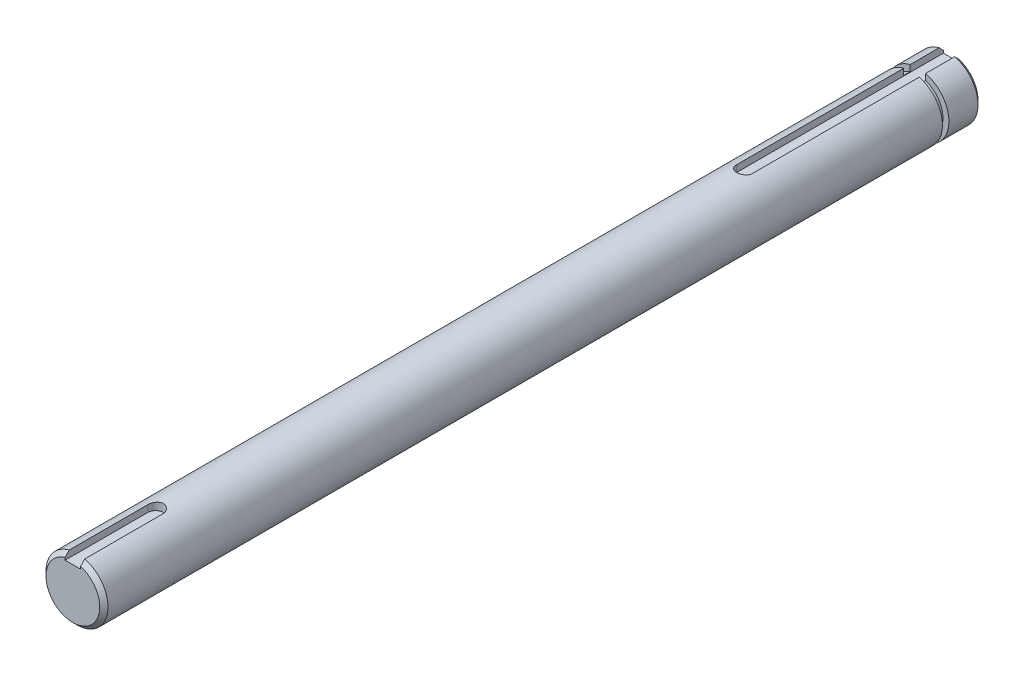
ISO-10303-21;
HEADER;
FILE_DESCRIPTION(('STEP AP214'),'2;1');
FILE_NAME('part.step','',(''),(''),'','','');
FILE_SCHEMA(('AUTOMOTIVE_DESIGN { 1 0 10303 214 1 1 1 1 }'));
ENDSEC;
DATA;
#1=APPLICATION_CONTEXT('core data for automotive mechanical design processes');
#2=APPLICATION_PROTOCOL_DEFINITION('international standard','automotive_design',2000,#1);
#3=PRODUCT_CONTEXT('',#1,'mechanical');
#4=PRODUCT('Part','Part','',(#3));
#5=PRODUCT_RELATED_PRODUCT_CATEGORY('part','',(#4));
#6=PRODUCT_DEFINITION_FORMATION('','',#4);
#7=PRODUCT_DEFINITION_CONTEXT('part definition',#1,'design');
#8=PRODUCT_DEFINITION('design','',#6,#7);
#9=PRODUCT_DEFINITION_SHAPE('','',#8);
#10=(LENGTH_UNIT() NAMED_UNIT(*) SI_UNIT(.MILLI.,.METRE.));
#11=(NAMED_UNIT(*) PLANE_ANGLE_UNIT() SI_UNIT($,.RADIAN.));
#12=(NAMED_UNIT(*) SI_UNIT($,.STERADIAN.) SOLID_ANGLE_UNIT());
#13=UNCERTAINTY_MEASURE_WITH_UNIT(LENGTH_MEASURE(1.E-05),#10,'distance_accuracy_value','');
#14=(GEOMETRIC_REPRESENTATION_CONTEXT(3) GLOBAL_UNCERTAINTY_ASSIGNED_CONTEXT((#13)) GLOBAL_UNIT_ASSIGNED_CONTEXT((#10,
#11,#12)) REPRESENTATION_CONTEXT('',''));
#15=CARTESIAN_POINT('',(0.,0.,0.));
#16=DIRECTION('',(0.,0.,1.));
#17=DIRECTION('',(1.,0.,0.));
#18=AXIS2_PLACEMENT_3D('',#15,#16,#17);
#19=CARTESIAN_POINT('',(0.,0.,0.634999999874708));
#20=DIRECTION('',(0.,0.,1.));
#21=DIRECTION('',(1.,0.,0.));
#22=AXIS2_PLACEMENT_3D('',#19,#20,#21);
#23=CONICAL_SURFACE('',#22,4.76249999991296,0.785398163397448);
#24=CARTESIAN_POINT('',(0.,0.,0.634999999999997));
#25=DIRECTION('',(0.,0.,-1.));
#26=DIRECTION('',(-1.,0.,0.));
#27=AXIS2_PLACEMENT_3D('',#24,#25,#26);
#28=CIRCLE('',#27,4.7625);
#29=CARTESIAN_POINT('',(-1.190625,4.61127079658254,0.63499999998507));
#30=VERTEX_POINT('',#29);
#31=CARTESIAN_POINT('',(1.190625,4.61127079658254,0.634999999985069));
#32=VERTEX_POINT('',#31);
#33=EDGE_CURVE('E138',#30,#32,#28,.F.);
#34=ORIENTED_EDGE('',*,*,#33,.F.);
#35=CARTESIAN_POINT('',(-1.190625,4.61127079658688,0.634999999970144));
#36=CARTESIAN_POINT('',(-1.190625,4.50169371341556,0.528861792536142));
#37=CARTESIAN_POINT('',(-1.190625,4.39196978784519,0.422876029411193));
#38=CARTESIAN_POINT('',(-1.190625,4.17222822168394,0.211209362667619));
#39=CARTESIAN_POINT('',(-1.190625,4.06221058101229,0.105528459132862));
#40=CARTESIAN_POINT('',(-1.190625,3.95204609786079,-8.97789113808919E-12));
#41=B_SPLINE_CURVE_WITH_KNOTS('',3,(#35,#36,#37,#38,#39,#40),.UNSPECIFIED.,.F.,.F.,(4,2,4),(0.,
0.457658056249166,0.915316238387231),.UNSPECIFIED.);
#42=CARTESIAN_POINT('',(-1.190625,3.95204609786548,-4.48885970284581E-12));
#43=VERTEX_POINT('',#42);
#44=EDGE_CURVE('E126',#30,#43,#41,.T.);
#45=ORIENTED_EDGE('',*,*,#44,.T.);
#46=CARTESIAN_POINT('',(0.,0.,0.));
#47=DIRECTION('',(0.,0.,1.));
#48=DIRECTION('',(1.,0.,0.));
#49=AXIS2_PLACEMENT_3D('',#46,#47,#48);
#50=CIRCLE('',#49,4.12750000003825);
#51=CARTESIAN_POINT('',(1.190625,3.95204609786548,-4.48893847578627E-12));
#52=VERTEX_POINT('',#51);
#53=EDGE_CURVE('E128',#43,#52,#50,.T.);
#54=ORIENTED_EDGE('',*,*,#53,.T.);
#55=CARTESIAN_POINT('',(1.190625,3.95204609786079,-8.97770320053053E-12));
#56=CARTESIAN_POINT('',(1.190625,4.06221058101229,0.105528459132862));
#57=CARTESIAN_POINT('',(1.190625,4.17222822168394,0.211209362667619));
#58=CARTESIAN_POINT('',(1.190625,4.39196978784518,0.422876029411192));
#59=CARTESIAN_POINT('',(1.190625,4.50169371341556,0.528861792536141));
#60=CARTESIAN_POINT('',(1.190625,4.61127079658688,0.634999999970141));
#61=B_SPLINE_CURVE_WITH_KNOTS('',3,(#55,#56,#57,#58,#59,#60),.UNSPECIFIED.,.F.,.F.,(4,2,4),(0.,
0.457658182138063,0.915316238387226),.UNSPECIFIED.);
#62=EDGE_CURVE('E21',#52,#32,#61,.T.);
#63=ORIENTED_EDGE('',*,*,#62,.T.);
#64=EDGE_LOOP('',(#34,#45,#54,#63));
#65=FACE_BOUND('',#64,.T.);
#66=ADVANCED_FACE('F17',(#65),#23,.T.);
#67=CARTESIAN_POINT('',(0.,0.,0.));
#68=DIRECTION('',(0.,0.,1.));
#69=DIRECTION('',(1.,0.,0.));
#70=AXIS2_PLACEMENT_3D('',#67,#68,#69);
#71=PLANE('',#70);
#72=ORIENTED_EDGE('',*,*,#53,.F.);
#73=DIRECTION('',(0.,1.,0.));
#74=VECTOR('',#73,1.);
#75=CARTESIAN_POINT('',(-1.190625,0.,0.));
#76=LINE('',#75,#74);
#77=CARTESIAN_POINT('',(-1.190625,3.571875,0.));
#78=VERTEX_POINT('',#77);
#79=EDGE_CURVE('E132',#78,#43,#76,.T.);
#80=ORIENTED_EDGE('',*,*,#79,.F.);
#81=DIRECTION('',(1.,0.,0.));
#82=VECTOR('',#81,1.);
#83=CARTESIAN_POINT('',(0.,3.571875,0.));
#84=LINE('',#83,#82);
#85=CARTESIAN_POINT('',(1.190625,3.571875,0.));
#86=VERTEX_POINT('',#85);
#87=EDGE_CURVE('E136',#86,#78,#84,.F.);
#88=ORIENTED_EDGE('',*,*,#87,.F.);
#89=DIRECTION('',(0.,1.,0.));
#90=VECTOR('',#89,1.);
#91=CARTESIAN_POINT('',(1.190625,0.,0.));
#92=LINE('',#91,#90);
#93=EDGE_CURVE('E119',#52,#86,#92,.F.);
#94=ORIENTED_EDGE('',*,*,#93,.F.);
#95=EDGE_LOOP('',(#72,#80,#88,#94));
#96=FACE_BOUND('',#95,.T.);
#97=ADVANCED_FACE('F134',(#96),#71,.F.);
#98=CARTESIAN_POINT('',(0.,0.,134.8994));
#99=DIRECTION('',(0.,0.,-1.));
#100=DIRECTION('',(-1.,0.,0.));
#101=AXIS2_PLACEMENT_3D('',#98,#99,#100);
#102=CYLINDRICAL_SURFACE('',#101,4.7625);
#103=DIRECTION('',(0.,0.,-1.));
#104=VECTOR('',#103,1.);
#105=CARTESIAN_POINT('',(-1.190625,4.61127079657821,0.));
#106=LINE('',#105,#104);
#107=CARTESIAN_POINT('',(-1.190625,4.61127079657821,5.10540000000001));
#108=VERTEX_POINT('',#107);
#109=EDGE_CURVE('E267',#30,#108,#106,.F.);
#110=ORIENTED_EDGE('',*,*,#109,.F.);
#111=ORIENTED_EDGE('',*,*,#33,.T.);
#112=DIRECTION('',(0.,0.,1.));
#113=VECTOR('',#112,1.);
#114=CARTESIAN_POINT('',(1.190625,4.61127079657821,0.));
#115=LINE('',#114,#113);
#116=CARTESIAN_POINT('',(1.190625,4.61127079657821,5.1054));
#117=VERTEX_POINT('',#116);
#118=EDGE_CURVE('E123',#117,#32,#115,.F.);
#119=ORIENTED_EDGE('',*,*,#118,.F.);
#120=CARTESIAN_POINT('',(0.,0.,5.10540000000001));
#121=DIRECTION('',(0.,0.,-1.));
#122=DIRECTION('',(-1.,0.,0.));
#123=AXIS2_PLACEMENT_3D('',#120,#121,#122);
#124=CIRCLE('',#123,4.7625);
#125=EDGE_CURVE('E276',#108,#117,#124,.F.);
#126=ORIENTED_EDGE('',*,*,#125,.F.);
#127=EDGE_LOOP('',(#110,#111,#119,#126));
#128=FACE_BOUND('',#127,.T.);
#129=ADVANCED_FACE('F321',(#128),#102,.T.);
#130=CARTESIAN_POINT('',(0.,3.571875,0.));
#131=DIRECTION('',(0.,1.,0.));
#132=DIRECTION('',(0.,0.,1.));
#133=AXIS2_PLACEMENT_3D('',#130,#131,#132);
#134=PLANE('',#133);
#135=DIRECTION('',(0.,0.,1.));
#136=VECTOR('',#135,1.);
#137=CARTESIAN_POINT('',(1.190625,3.571875,0.));
#138=LINE('',#137,#136);
#139=CARTESIAN_POINT('',(1.190625,3.571875,31.75));
#140=VERTEX_POINT('',#139);
#141=EDGE_CURVE('E264',#86,#140,#138,.T.);
#142=ORIENTED_EDGE('',*,*,#141,.F.);
#143=ORIENTED_EDGE('',*,*,#87,.T.);
#144=DIRECTION('',(0.,0.,-1.));
#145=VECTOR('',#144,1.);
#146=CARTESIAN_POINT('',(-1.190625,3.571875,0.));
#147=LINE('',#146,#145);
#148=CARTESIAN_POINT('',(-1.190625,3.571875,31.75));
#149=VERTEX_POINT('',#148);
#150=EDGE_CURVE('E252',#149,#78,#147,.T.);
#151=ORIENTED_EDGE('',*,*,#150,.F.);
#152=CARTESIAN_POINT('',(0.,3.571875,31.75));
#153=DIRECTION('',(0.,1.,0.));
#154=DIRECTION('',(0.,0.,1.));
#155=AXIS2_PLACEMENT_3D('',#152,#153,#154);
#156=CIRCLE('',#155,1.190625);
#157=EDGE_CURVE('E260',#149,#140,#156,.T.);
#158=ORIENTED_EDGE('',*,*,#157,.T.);
#159=EDGE_LOOP('',(#142,#143,#151,#158));
#160=FACE_BOUND('',#159,.T.);
#161=ADVANCED_FACE('F328',(#160),#134,.T.);
#162=CARTESIAN_POINT('',(0.,3.571875,0.));
#163=DIRECTION('',(0.,1.,0.));
#164=DIRECTION('',(0.,0.,1.));
#165=AXIS2_PLACEMENT_3D('',#162,#163,#164);
#166=PLANE('',#165);
#167=DIRECTION('',(0.,0.,1.));
#168=VECTOR('',#167,1.);
#169=CARTESIAN_POINT('',(-1.19062500000001,3.571875,0.));
#170=LINE('',#169,#168);
#171=CARTESIAN_POINT('',(-1.190625,3.571875,122.1994));
#172=VERTEX_POINT('',#171);
#173=CARTESIAN_POINT('',(-1.190625,3.571875,134.8994));
#174=VERTEX_POINT('',#173);
#175=EDGE_CURVE('E282',#172,#174,#170,.T.);
#176=ORIENTED_EDGE('',*,*,#175,.T.);
#177=DIRECTION('',(1.,0.,0.));
#178=VECTOR('',#177,1.);
#179=CARTESIAN_POINT('',(0.,3.571875,134.8994));
#180=LINE('',#179,#178);
#181=CARTESIAN_POINT('',(1.190625,3.571875,134.8994));
#182=VERTEX_POINT('',#181);
#183=EDGE_CURVE('E270',#182,#174,#180,.F.);
#184=ORIENTED_EDGE('',*,*,#183,.F.);
#185=DIRECTION('',(0.,0.,-1.));
#186=VECTOR('',#185,1.);
#187=CARTESIAN_POINT('',(1.19062499999998,3.571875,0.));
#188=LINE('',#187,#186);
#189=CARTESIAN_POINT('',(1.190625,3.571875,122.1994));
#190=VERTEX_POINT('',#189);
#191=EDGE_CURVE('E246',#182,#190,#188,.T.);
#192=ORIENTED_EDGE('',*,*,#191,.T.);
#193=CARTESIAN_POINT('',(0.,3.571875,122.1994));
#194=DIRECTION('',(0.,1.,0.));
#195=DIRECTION('',(0.,0.,1.));
#196=AXIS2_PLACEMENT_3D('',#193,#194,#195);
#197=CIRCLE('',#196,1.190625);
#198=EDGE_CURVE('E205',#190,#172,#197,.T.);
#199=ORIENTED_EDGE('',*,*,#198,.T.);
#200=EDGE_LOOP('',(#176,#184,#192,#199));
#201=FACE_BOUND('',#200,.T.);
#202=ADVANCED_FACE('F348',(#201),#166,.T.);
#203=CARTESIAN_POINT('',(4.7625,0.,5.1054));
#204=DIRECTION('',(0.,0.,1.));
#205=DIRECTION('',(1.,0.,0.));
#206=AXIS2_PLACEMENT_3D('',#203,#204,#205);
#207=PLANE('',#206);
#208=DIRECTION('',(0.,1.,0.));
#209=VECTOR('',#208,1.);
#210=CARTESIAN_POINT('',(-1.190625,3.571875,5.10540000000001));
#211=LINE('',#210,#209);
#212=CARTESIAN_POINT('',(-1.190625,3.65927393336096,5.1054));
#213=VERTEX_POINT('',#212);
#214=EDGE_CURVE('E256',#108,#213,#211,.F.);
#215=ORIENTED_EDGE('',*,*,#214,.F.);
#216=ORIENTED_EDGE('',*,*,#125,.T.);
#217=DIRECTION('',(0.,1.,0.));
#218=VECTOR('',#217,1.);
#219=CARTESIAN_POINT('',(1.190625,3.571875,5.1054));
#220=LINE('',#219,#218);
#221=CARTESIAN_POINT('',(1.190625,3.65927393336096,5.1054));
#222=VERTEX_POINT('',#221);
#223=EDGE_CURVE('E268',#222,#117,#220,.T.);
#224=ORIENTED_EDGE('',*,*,#223,.F.);
#225=CARTESIAN_POINT('',(0.,0.,5.1054));
#226=DIRECTION('',(0.,0.,-1.));
#227=DIRECTION('',(-1.,0.,0.));
#228=AXIS2_PLACEMENT_3D('',#225,#226,#227);
#229=CIRCLE('',#228,3.8481);
#230=EDGE_CURVE('E204',#213,#222,#229,.F.);
#231=ORIENTED_EDGE('',*,*,#230,.F.);
#232=EDGE_LOOP('',(#215,#216,#224,#231));
#233=FACE_BOUND('',#232,.T.);
#234=ADVANCED_FACE('F317',(#233),#207,.T.);
#235=CARTESIAN_POINT('',(0.,0.,134.8994));
#236=DIRECTION('',(0.,0.,1.));
#237=DIRECTION('',(1.,0.,0.));
#238=AXIS2_PLACEMENT_3D('',#235,#236,#237);
#239=PLANE('',#238);
#240=DIRECTION('',(0.,1.,0.));
#241=VECTOR('',#240,1.);
#242=CARTESIAN_POINT('',(1.190625,3.571875,134.8994));
#243=LINE('',#242,#241);
#244=CARTESIAN_POINT('',(1.190625,3.95204609781389,134.899399999992));
#245=VERTEX_POINT('',#244);
#246=EDGE_CURVE('E202',#245,#182,#243,.F.);
#247=ORIENTED_EDGE('',*,*,#246,.T.);
#248=ORIENTED_EDGE('',*,*,#183,.T.);
#249=DIRECTION('',(0.,1.,0.));
#250=VECTOR('',#249,1.);
#251=CARTESIAN_POINT('',(-1.190625,3.571875,134.8994));
#252=LINE('',#251,#250);
#253=CARTESIAN_POINT('',(-1.190625,3.95204609780807,134.899399999997));
#254=VERTEX_POINT('',#253);
#255=EDGE_CURVE('E285',#174,#254,#252,.T.);
#256=ORIENTED_EDGE('',*,*,#255,.T.);
#257=CARTESIAN_POINT('',(0.,0.,134.899399999995));
#258=DIRECTION('',(0.,0.,-1.));
#259=DIRECTION('',(-1.,0.,0.));
#260=AXIS2_PLACEMENT_3D('',#257,#258,#259);
#261=CIRCLE('',#260,4.12749999998141);
#262=EDGE_CURVE('E237',#245,#254,#261,.T.);
#263=ORIENTED_EDGE('',*,*,#262,.F.);
#264=EDGE_LOOP('',(#247,#248,#256,#263));
#265=FACE_BOUND('',#264,.T.);
#266=ADVANCED_FACE('F342',(#265),#239,.T.);
#267=CARTESIAN_POINT('',(1.190625,3.571875,0.));
#268=DIRECTION('',(-1.,0.,0.));
#269=DIRECTION('',(0.,0.,1.));
#270=AXIS2_PLACEMENT_3D('',#267,#268,#269);
#271=PLANE('',#270);
#272=DIRECTION('',(0.,0.,-1.));
#273=VECTOR('',#272,1.);
#274=CARTESIAN_POINT('',(1.190625,4.61127079657821,134.8994));
#275=LINE('',#274,#273);
#276=CARTESIAN_POINT('',(1.190625,4.61127079657821,6.09599999999999));
#277=VERTEX_POINT('',#276);
#278=CARTESIAN_POINT('',(1.190625,4.61127079657821,31.75));
#279=VERTEX_POINT('',#278);
#280=EDGE_CURVE('E234',#277,#279,#275,.F.);
#281=ORIENTED_EDGE('',*,*,#280,.F.);
#282=DIRECTION('',(0.,1.,0.));
#283=VECTOR('',#282,1.);
#284=CARTESIAN_POINT('',(1.190625,3.571875,6.09599999999999));
#285=LINE('',#284,#283);
#286=CARTESIAN_POINT('',(1.190625,3.65927393336096,6.096));
#287=VERTEX_POINT('',#286);
#288=EDGE_CURVE('E261',#277,#287,#285,.F.);
#289=ORIENTED_EDGE('',*,*,#288,.T.);
#290=DIRECTION('',(0.,0.,-1.));
#291=VECTOR('',#290,1.);
#292=CARTESIAN_POINT('',(1.190625,3.65927393336096,0.));
#293=LINE('',#292,#291);
#294=EDGE_CURVE('E243',#222,#287,#293,.F.);
#295=ORIENTED_EDGE('',*,*,#294,.F.);
#296=ORIENTED_EDGE('',*,*,#223,.T.);
#297=ORIENTED_EDGE('',*,*,#118,.T.);
#298=ORIENTED_EDGE('',*,*,#62,.F.);
#299=ORIENTED_EDGE('',*,*,#93,.T.);
#300=ORIENTED_EDGE('',*,*,#141,.T.);
#301=DIRECTION('',(0.,1.,0.));
#302=VECTOR('',#301,1.);
#303=CARTESIAN_POINT('',(1.190625,3.571875,31.75));
#304=LINE('',#303,#302);
#305=EDGE_CURVE('E257',#140,#279,#304,.T.);
#306=ORIENTED_EDGE('',*,*,#305,.T.);
#307=EDGE_LOOP('',(#281,#289,#295,#296,#297,#298,#299,#300,#306));
#308=FACE_BOUND('',#307,.T.);
#309=ADVANCED_FACE('F116',(#308),#271,.T.);
#310=CARTESIAN_POINT('',(0.,3.571875,31.75));
#311=DIRECTION('',(0.,1.,0.));
#312=DIRECTION('',(0.,0.,1.));
#313=AXIS2_PLACEMENT_3D('',#310,#311,#312);
#314=CYLINDRICAL_SURFACE('',#313,1.190625);
#315=ORIENTED_EDGE('',*,*,#157,.F.);
#316=DIRECTION('',(0.,1.,0.));
#317=VECTOR('',#316,1.);
#318=CARTESIAN_POINT('',(-1.190625,3.571875,31.75));
#319=LINE('',#318,#317);
#320=CARTESIAN_POINT('',(-1.190625,4.61127079657821,31.75));
#321=VERTEX_POINT('',#320);
#322=EDGE_CURVE('E249',#321,#149,#319,.F.);
#323=ORIENTED_EDGE('',*,*,#322,.F.);
#324=CARTESIAN_POINT('',(1.190625,4.61127079657821,31.75));
#325=CARTESIAN_POINT('',(1.19062540104158,4.6112685815143,31.7829362139957));
#326=CARTESIAN_POINT('',(1.1892574588091,4.61162411785418,31.8158561079094));
#327=CARTESIAN_POINT('',(1.18380427288302,4.61302780080314,31.8814496949418));
#328=CARTESIAN_POINT('',(1.17971948641086,4.61407583087131,31.9141234285515));
#329=CARTESIAN_POINT('',(1.1634492949417,4.6182166143753,32.0112863273555));
#330=CARTESIAN_POINT('',(1.1472477972003,4.62230632032561,32.075107805554));
#331=CARTESIAN_POINT('',(1.10465921593457,4.63266746706155,32.1990151598646));
#332=CARTESIAN_POINT('',(1.07827291807276,4.63893873955594,32.2591013237064));
#333=CARTESIAN_POINT('',(1.01609638317228,4.65295246882649,32.3740221435306));
#334=CARTESIAN_POINT('',(0.980303956363174,4.66069526806141,32.4288555726017));
#335=CARTESIAN_POINT('',(0.899502875292073,4.67696780915812,32.53288295104));
#336=CARTESIAN_POINT('',(0.854327255498637,4.68551000541576,32.5819452245343));
#337=CARTESIAN_POINT('',(0.756385283399081,4.70231349722759,32.6718953268357));
#338=CARTESIAN_POINT('',(0.70361621807814,4.7105746910743,32.7127802214672));
#339=CARTESIAN_POINT('',(0.591067151853077,4.72602536124834,32.7857561096851));
#340=CARTESIAN_POINT('',(0.531197385565056,4.73319775135871,32.8177124467036));
#341=CARTESIAN_POINT('',(0.406767882945179,4.74550712842434,32.8710252576489));
#342=CARTESIAN_POINT('',(0.342213875021634,4.75064655347703,32.8923944363763));
#343=CARTESIAN_POINT('',(0.231114285230735,4.75710517954441,32.9189033955095));
#344=CARTESIAN_POINT('',(0.185300443017798,4.75911776654352,32.9270349602129));
#345=CARTESIAN_POINT('',(0.0929973408076781,4.76181576665587,32.937896731406));
#346=CARTESIAN_POINT('',(0.0465080906679589,4.76250119911915,32.9406270166468));
#347=CARTESIAN_POINT('',(-0.0657602975614739,4.76249830450077,32.9406221485543));
#348=CARTESIAN_POINT('',(-0.131558262345111,4.76112385001979,32.935156699621));
#349=CARTESIAN_POINT('',(-0.261285393775975,4.75577159354209,32.9134653298398));
#350=CARTESIAN_POINT('',(-0.325212718804579,4.75179131063537,32.8972291543976));
#351=CARTESIAN_POINT('',(-0.449280219712139,4.74166884315868,32.8545506440484));
#352=CARTESIAN_POINT('',(-0.509425434418321,4.7355296100723,32.8281222381147));
#353=CARTESIAN_POINT('',(-0.624424451249644,4.72174322287198,32.7658538838095));
#354=CARTESIAN_POINT('',(-0.679278387913966,4.71409610711341,32.7300141748217));
#355=CARTESIAN_POINT('',(-0.783272743352562,4.69794778591093,32.6491604321556));
#356=CARTESIAN_POINT('',(-0.832288724170211,4.68943339968032,32.6039889759844));
#357=CARTESIAN_POINT('',(-0.922136398786186,4.6725972288711,32.5060868143271));
#358=CARTESIAN_POINT('',(-0.962966789516616,4.66427547514396,32.4533549075773));
#359=CARTESIAN_POINT('',(-1.03587544153791,4.64863251291999,32.3408561740249));
#360=CARTESIAN_POINT('',(-1.06781190272269,4.64132835187839,32.2809949617975));
#361=CARTESIAN_POINT('',(-1.1211038028444,4.62874570534529,32.1565548272178));
#362=CARTESIAN_POINT('',(-1.14246718611987,4.62346569963004,32.0919794889321));
#363=CARTESIAN_POINT('',(-1.16894735895324,4.61682717101909,31.9808814758016));
#364=CARTESIAN_POINT('',(-1.17706381086915,4.61475691268567,31.9350941410544));
#365=CARTESIAN_POINT('',(-1.18790600788606,4.61197288662725,31.8428794401158));
#366=CARTESIAN_POINT('',(-1.19063563538912,4.61125814196842,31.7964525591789));
#367=CARTESIAN_POINT('',(-1.190625,4.61127079657821,31.75));
#368=B_SPLINE_CURVE_WITH_KNOTS('',3,(#324,#325,#326,#327,#328,#329,#330,#331,#332,#333,#334,
#335,#336,#337,#338,#339,#340,#341,#342,#343,#344,#345,#346,#347,#348,#349,#350,#351,#352,#353,
#354,#355,#356,#357,#358,#359,#360,#361,#362,#363,#364,#365,#366,#367),.UNSPECIFIED.,.F.,.F.,(4,
2,2,2,2,2,2,2,2,2,2,2,2,2,2,2,2,2,2,2,2,4),(0.,0.0987462236634992,0.197475833392973,
0.394370674351564,0.591250329740403,0.788175859872632,0.988963083618798,1.18982222432221,
1.39356459986758,1.59706188470311,1.73646630473024,1.87586869221321,2.07297724580035,
2.27027373236867,2.46730153835968,2.66432433328327,2.86499113681376,3.06568985926486,
3.26942582898406,3.47300848344928,3.61233292180275,3.75155690926415),.UNSPECIFIED.);
#369=EDGE_CURVE('E161',#279,#321,#368,.T.);
#370=ORIENTED_EDGE('',*,*,#369,.F.);
#371=ORIENTED_EDGE('',*,*,#305,.F.);
#372=EDGE_LOOP('',(#315,#323,#370,#371));
#373=FACE_BOUND('',#372,.T.);
#374=ADVANCED_FACE('F307',(#373),#314,.F.);
#375=CARTESIAN_POINT('',(-1.190625,3.571875,0.));
#376=DIRECTION('',(1.,0.,0.));
#377=DIRECTION('',(0.,0.,-1.));
#378=AXIS2_PLACEMENT_3D('',#375,#376,#377);
#379=PLANE('',#378);
#380=ORIENTED_EDGE('',*,*,#79,.T.);
#381=ORIENTED_EDGE('',*,*,#44,.F.);
#382=ORIENTED_EDGE('',*,*,#109,.T.);
#383=ORIENTED_EDGE('',*,*,#214,.T.);
#384=DIRECTION('',(0.,0.,-1.));
#385=VECTOR('',#384,1.);
#386=CARTESIAN_POINT('',(-1.190625,3.65927393336096,0.));
#387=LINE('',#386,#385);
#388=CARTESIAN_POINT('',(-1.190625,3.65927393336096,6.096));
#389=VERTEX_POINT('',#388);
#390=EDGE_CURVE('E241',#389,#213,#387,.T.);
#391=ORIENTED_EDGE('',*,*,#390,.F.);
#392=DIRECTION('',(0.,1.,0.));
#393=VECTOR('',#392,1.);
#394=CARTESIAN_POINT('',(-1.190625,3.571875,6.096));
#395=LINE('',#394,#393);
#396=CARTESIAN_POINT('',(-1.190625,4.61127079657821,6.09599999999999));
#397=VERTEX_POINT('',#396);
#398=EDGE_CURVE('E253',#389,#397,#395,.T.);
#399=ORIENTED_EDGE('',*,*,#398,.T.);
#400=DIRECTION('',(0.,0.,-1.));
#401=VECTOR('',#400,1.);
#402=CARTESIAN_POINT('',(-1.190625,4.61127079657821,134.8994));
#403=LINE('',#402,#401);
#404=EDGE_CURVE('E231',#321,#397,#403,.T.);
#405=ORIENTED_EDGE('',*,*,#404,.F.);
#406=ORIENTED_EDGE('',*,*,#322,.T.);
#407=ORIENTED_EDGE('',*,*,#150,.T.);
#408=EDGE_LOOP('',(#380,#381,#382,#383,#391,#399,#405,#406,#407));
#409=FACE_BOUND('',#408,.T.);
#410=ADVANCED_FACE('F329',(#409),#379,.T.);
#411=CARTESIAN_POINT('',(-1.19062500000001,3.571875,0.));
#412=DIRECTION('',(-1.,0.,0.));
#413=DIRECTION('',(0.,0.,1.));
#414=AXIS2_PLACEMENT_3D('',#411,#412,#413);
#415=PLANE('',#414);
#416=CARTESIAN_POINT('',(-1.190625,3.95204609781605,134.89939999999));
#417=CARTESIAN_POINT('',(-1.190625,4.0622105809716,134.793871540844));
#418=CARTESIAN_POINT('',(-1.190625,4.1722282216473,134.688190637306));
#419=CARTESIAN_POINT('',(-1.190625,4.3919697878166,134.476523970554));
#420=CARTESIAN_POINT('',(-1.190625,4.50169371339099,134.370538207426));
#421=CARTESIAN_POINT('',(-1.190625,4.6112707965663,134.264399999988));
#422=B_SPLINE_CURVE_WITH_KNOTS('',3,(#416,#417,#418,#419,#420,#421),.UNSPECIFIED.,.F.,.F.,(4,2,
4),(0.,0.457658182154723,0.915316238420541),.UNSPECIFIED.);
#423=CARTESIAN_POINT('',(-1.190625,4.61127079657225,134.264399999994));
#424=VERTEX_POINT('',#423);
#425=EDGE_CURVE('E189',#254,#424,#422,.T.);
#426=ORIENTED_EDGE('',*,*,#425,.F.);
#427=ORIENTED_EDGE('',*,*,#255,.F.);
#428=ORIENTED_EDGE('',*,*,#175,.F.);
#429=DIRECTION('',(0.,1.,0.));
#430=VECTOR('',#429,1.);
#431=CARTESIAN_POINT('',(-1.190625,3.571875,122.1994));
#432=LINE('',#431,#430);
#433=CARTESIAN_POINT('',(-1.190625,4.61127079657821,122.1994));
#434=VERTEX_POINT('',#433);
#435=EDGE_CURVE('E247',#172,#434,#432,.T.);
#436=ORIENTED_EDGE('',*,*,#435,.T.);
#437=DIRECTION('',(0.,0.,-1.));
#438=VECTOR('',#437,1.);
#439=CARTESIAN_POINT('',(-1.190625,4.61127079657821,134.8994));
#440=LINE('',#439,#438);
#441=EDGE_CURVE('E160',#424,#434,#440,.T.);
#442=ORIENTED_EDGE('',*,*,#441,.F.);
#443=EDGE_LOOP('',(#426,#427,#428,#436,#442));
#444=FACE_BOUND('',#443,.T.);
#445=ADVANCED_FACE('F215',(#444),#415,.F.);
#446=CARTESIAN_POINT('',(0.,3.571875,122.1994));
#447=DIRECTION('',(0.,1.,0.));
#448=DIRECTION('',(0.,0.,1.));
#449=AXIS2_PLACEMENT_3D('',#446,#447,#448);
#450=CYLINDRICAL_SURFACE('',#449,1.190625);
#451=ORIENTED_EDGE('',*,*,#198,.F.);
#452=DIRECTION('',(0.,1.,0.));
#453=VECTOR('',#452,1.);
#454=CARTESIAN_POINT('',(1.190625,3.571875,122.1994));
#455=LINE('',#454,#453);
#456=CARTESIAN_POINT('',(1.190625,4.61127079657821,122.1994));
#457=VERTEX_POINT('',#456);
#458=EDGE_CURVE('E203',#190,#457,#455,.T.);
#459=ORIENTED_EDGE('',*,*,#458,.T.);
#460=CARTESIAN_POINT('',(-1.190625,4.61127079657821,122.1994));
#461=CARTESIAN_POINT('',(-1.19062540183131,4.61126858153273,122.166463758358));
#462=CARTESIAN_POINT('',(-1.1892574569063,4.61162411846089,122.133543836844));
#463=CARTESIAN_POINT('',(-1.18380426108057,4.61302780372209,122.067950195467));
#464=CARTESIAN_POINT('',(-1.17971946742247,4.61407583550884,122.03527643511));
#465=CARTESIAN_POINT('',(-1.16344926938982,4.61821662126101,121.938113565648));
#466=CARTESIAN_POINT('',(-1.14724778706475,4.62230632499051,121.874292142213));
#467=CARTESIAN_POINT('',(-1.10465958453277,4.63266737518841,121.750385935278));
#468=CARTESIAN_POINT('',(-1.07827382145775,4.63893851663701,121.690300801253));
#469=CARTESIAN_POINT('',(-1.01609768446204,4.65295219480653,121.575379806454));
#470=CARTESIAN_POINT('',(-0.980304788684342,4.66069512592942,121.520545358667));
#471=CARTESIAN_POINT('',(-0.899498699270288,4.67696862417649,121.416511815606));
#472=CARTESIAN_POINT('',(-0.854317810645918,4.68551169943803,121.367444963564));
#473=CARTESIAN_POINT('',(-0.756375226177137,4.70231514921718,121.27749657471));
#474=CARTESIAN_POINT('',(-0.703612320879484,4.71057547837146,121.23661634629));
#475=CARTESIAN_POINT('',(-0.591093995850136,4.72602142030992,121.163662213698));
#476=CARTESIAN_POINT('',(-0.531251327085728,4.73319044011685,121.131719061344));
#477=CARTESIAN_POINT('',(-0.406839647222345,4.74550199754607,121.078397113347));
#478=CARTESIAN_POINT('',(-0.34227156917383,4.75064493395316,121.057016238568));
#479=CARTESIAN_POINT('',(-0.211626579212767,4.75823637193606,121.025849761724));
#480=CARTESIAN_POINT('',(-0.14560667713465,4.76073731423111,121.015838177522));
#481=CARTESIAN_POINT('',(-0.0127787110459968,4.76294574798315,121.006985048256));
#482=CARTESIAN_POINT('',(0.0540292528466807,4.76265359054695,121.00814209924));
#483=CARTESIAN_POINT('',(0.184966561944905,4.75934766988579,121.021431300513));
#484=CARTESIAN_POINT('',(0.249122448009017,4.75639445925233,121.033319277889));
#485=CARTESIAN_POINT('',(0.374497652884795,4.74816881164078,121.067340271152));
#486=CARTESIAN_POINT('',(0.435716841636064,4.74289627204928,121.08947374033));
#487=CARTESIAN_POINT('',(0.55412554992297,4.73053169210141,121.143555274798));
#488=CARTESIAN_POINT('',(0.611273577745178,4.72342361400933,121.175590366258));
#489=CARTESIAN_POINT('',(0.719466864058236,4.70815922660848,121.248499163958));
#490=CARTESIAN_POINT('',(0.770511201341351,4.70000275945464,121.28937420177));
#491=CARTESIAN_POINT('',(0.866500429621675,4.68327064545974,121.380105829697));
#492=CARTESIAN_POINT('',(0.911243775823825,4.67468962599994,121.430174854755));
#493=CARTESIAN_POINT('',(0.991754400456121,4.65827469113145,121.537209935311));
#494=CARTESIAN_POINT('',(1.02751922176053,4.65044098059939,121.594177872503));
#495=CARTESIAN_POINT('',(1.0891893569936,4.63638678051219,121.713798352409));
#496=CARTESIAN_POINT('',(1.11504057442203,4.63017519967129,121.776479837892));
#497=CARTESIAN_POINT('',(1.1557424876712,4.6201852939215,121.905454842898));
#498=CARTESIAN_POINT('',(1.17060962840569,4.61640333259709,121.971742802538));
#499=CARTESIAN_POINT('',(1.18336770622658,4.6131395546769,122.065403943966));
#500=CARTESIAN_POINT('',(1.18608966049474,4.61243985328867,122.092148146638));
#501=CARTESIAN_POINT('',(1.18971626463346,4.61150568150935,122.145723993611));
#502=CARTESIAN_POINT('',(1.1906238547331,4.61127045842546,122.172555425747));
#503=CARTESIAN_POINT('',(1.190625,4.61127079657821,122.1994));
#504=B_SPLINE_CURVE_WITH_KNOTS('',3,(#460,#461,#462,#463,#464,#465,#466,#467,#468,#469,#470,
#471,#472,#473,#474,#475,#476,#477,#478,#479,#480,#481,#482,#483,#484,#485,#486,#487,#488,#489,
#490,#491,#492,#493,#494,#495,#496,#497,#498,#499,#500,#501,#502,#503),.UNSPECIFIED.,.F.,.F.,(4,
2,2,2,2,2,2,2,2,2,2,2,2,2,2,2,2,2,2,2,2,4),(0.,0.0987463064357856,0.197475998182044,
0.394370674792508,0.59124685149021,0.788175860534048,0.98898300912518,1.18982222530761,
1.39346210263837,1.59706187840794,1.79653979554184,1.99599263761811,2.19101843211263,
2.3860528559467,2.58285269064355,2.77968219023155,2.98181827039566,3.18400960837341,
3.38728907441772,3.59026357852296,3.67088557385403,3.7513768126802),.UNSPECIFIED.);
#505=EDGE_CURVE('E152',#434,#457,#504,.T.);
#506=ORIENTED_EDGE('',*,*,#505,.F.);
#507=ORIENTED_EDGE('',*,*,#435,.F.);
#508=EDGE_LOOP('',(#451,#459,#506,#507));
#509=FACE_BOUND('',#508,.T.);
#510=ADVANCED_FACE('F167',(#509),#450,.F.);
#511=CARTESIAN_POINT('',(1.19062499999998,3.571875,0.));
#512=DIRECTION('',(1.,0.,0.));
#513=DIRECTION('',(0.,0.,-1.));
#514=AXIS2_PLACEMENT_3D('',#511,#512,#513);
#515=PLANE('',#514);
#516=CARTESIAN_POINT('',(1.190625,4.6112707965663,134.264399999988));
#517=CARTESIAN_POINT('',(1.190625,4.50169371339114,134.370538207425));
#518=CARTESIAN_POINT('',(1.190625,4.39196978781691,134.476523970554));
#519=CARTESIAN_POINT('',(1.190625,4.17222822164792,134.688190637305));
#520=CARTESIAN_POINT('',(1.190625,4.06221058097238,134.793871540843));
#521=CARTESIAN_POINT('',(1.190625,3.95204609781698,134.899399999989));
#522=B_SPLINE_CURVE_WITH_KNOTS('',3,(#516,#517,#518,#519,#520,#521),.UNSPECIFIED.,.F.,.F.,(4,2,
4),(0.,0.457658056265177,0.915316238419251),.UNSPECIFIED.);
#523=CARTESIAN_POINT('',(1.190625,4.61127079657225,134.264399999994));
#524=VERTEX_POINT('',#523);
#525=EDGE_CURVE('E196',#524,#245,#522,.T.);
#526=ORIENTED_EDGE('',*,*,#525,.F.);
#527=DIRECTION('',(0.,0.,-1.));
#528=VECTOR('',#527,1.);
#529=CARTESIAN_POINT('',(1.190625,4.61127079657821,134.8994));
#530=LINE('',#529,#528);
#531=EDGE_CURVE('E151',#457,#524,#530,.F.);
#532=ORIENTED_EDGE('',*,*,#531,.F.);
#533=ORIENTED_EDGE('',*,*,#458,.F.);
#534=ORIENTED_EDGE('',*,*,#191,.F.);
#535=ORIENTED_EDGE('',*,*,#246,.F.);
#536=EDGE_LOOP('',(#526,#532,#533,#534,#535));
#537=FACE_BOUND('',#536,.T.);
#538=ADVANCED_FACE('F206',(#537),#515,.F.);
#539=CARTESIAN_POINT('',(0.,0.,0.));
#540=DIRECTION('',(0.,0.,-1.));
#541=DIRECTION('',(-1.,0.,0.));
#542=AXIS2_PLACEMENT_3D('',#539,#540,#541);
#543=CYLINDRICAL_SURFACE('',#542,3.8481);
#544=CARTESIAN_POINT('',(0.,0.,6.096));
#545=DIRECTION('',(0.,0.,-1.));
#546=DIRECTION('',(-1.,0.,0.));
#547=AXIS2_PLACEMENT_3D('',#544,#545,#546);
#548=CIRCLE('',#547,3.8481);
#549=EDGE_CURVE('E40',#389,#287,#548,.F.);
#550=ORIENTED_EDGE('',*,*,#549,.F.);
#551=ORIENTED_EDGE('',*,*,#390,.T.);
#552=ORIENTED_EDGE('',*,*,#230,.T.);
#553=ORIENTED_EDGE('',*,*,#294,.T.);
#554=EDGE_LOOP('',(#550,#551,#552,#553));
#555=FACE_BOUND('',#554,.T.);
#556=ADVANCED_FACE('F185',(#555),#543,.T.);
#557=CARTESIAN_POINT('',(0.,0.,134.26439999995));
#558=DIRECTION('',(0.,0.,-1.));
#559=DIRECTION('',(-1.,0.,0.));
#560=AXIS2_PLACEMENT_3D('',#557,#558,#559);
#561=CONICAL_SURFACE('',#560,4.76250000002665,0.785398163397448);
#562=ORIENTED_EDGE('',*,*,#262,.T.);
#563=ORIENTED_EDGE('',*,*,#425,.T.);
#564=CARTESIAN_POINT('',(0.,0.,134.2644));
#565=DIRECTION('',(0.,0.,-1.));
#566=DIRECTION('',(-1.,0.,0.));
#567=AXIS2_PLACEMENT_3D('',#564,#565,#566);
#568=CIRCLE('',#567,4.7625);
#569=EDGE_CURVE('E31',#524,#424,#568,.T.);
#570=ORIENTED_EDGE('',*,*,#569,.F.);
#571=ORIENTED_EDGE('',*,*,#525,.T.);
#572=EDGE_LOOP('',(#562,#563,#570,#571));
#573=FACE_BOUND('',#572,.T.);
#574=ADVANCED_FACE('F180',(#573),#561,.T.);
#575=CARTESIAN_POINT('',(3.8481,0.,6.096));
#576=DIRECTION('',(0.,0.,-1.));
#577=DIRECTION('',(-1.,0.,0.));
#578=AXIS2_PLACEMENT_3D('',#575,#576,#577);
#579=PLANE('',#578);
#580=ORIENTED_EDGE('',*,*,#398,.F.);
#581=ORIENTED_EDGE('',*,*,#549,.T.);
#582=ORIENTED_EDGE('',*,*,#288,.F.);
#583=CARTESIAN_POINT('',(0.,0.,6.09599999999999));
#584=DIRECTION('',(0.,0.,-1.));
#585=DIRECTION('',(-1.,0.,0.));
#586=AXIS2_PLACEMENT_3D('',#583,#584,#585);
#587=CIRCLE('',#586,4.7625);
#588=EDGE_CURVE('E11',#397,#277,#587,.F.);
#589=ORIENTED_EDGE('',*,*,#588,.F.);
#590=EDGE_LOOP('',(#580,#581,#582,#589));
#591=FACE_BOUND('',#590,.T.);
#592=ADVANCED_FACE('F175',(#591),#579,.T.);
#593=CARTESIAN_POINT('',(0.,0.,134.8994));
#594=DIRECTION('',(0.,0.,-1.));
#595=DIRECTION('',(-1.,0.,0.));
#596=AXIS2_PLACEMENT_3D('',#593,#594,#595);
#597=CYLINDRICAL_SURFACE('',#596,4.7625);
#598=ORIENTED_EDGE('',*,*,#531,.T.);
#599=ORIENTED_EDGE('',*,*,#569,.T.);
#600=ORIENTED_EDGE('',*,*,#441,.T.);
#601=ORIENTED_EDGE('',*,*,#505,.T.);
#602=EDGE_LOOP('',(#598,#599,#600,#601));
#603=FACE_BOUND('',#602,.T.);
#604=ORIENTED_EDGE('',*,*,#588,.T.);
#605=ORIENTED_EDGE('',*,*,#280,.T.);
#606=ORIENTED_EDGE('',*,*,#369,.T.);
#607=ORIENTED_EDGE('',*,*,#404,.T.);
#608=EDGE_LOOP('',(#604,#605,#606,#607));
#609=FACE_BOUND('',#608,.T.);
#610=ADVANCED_FACE('F171',(#603,#609),#597,.T.);
#611=CLOSED_SHELL('',(#66,#97,#129,#161,#202,#234,#266,#309,#374,#410,#445,#510,#538,#556,#574,
#592,#610));
#612=MANIFOLD_SOLID_BREP('B1',#611);
#613=ADVANCED_BREP_SHAPE_REPRESENTATION('',(#18,#612),#14);
#614=SHAPE_DEFINITION_REPRESENTATION(#9,#613);
ENDSEC;
END-ISO-10303-21;
